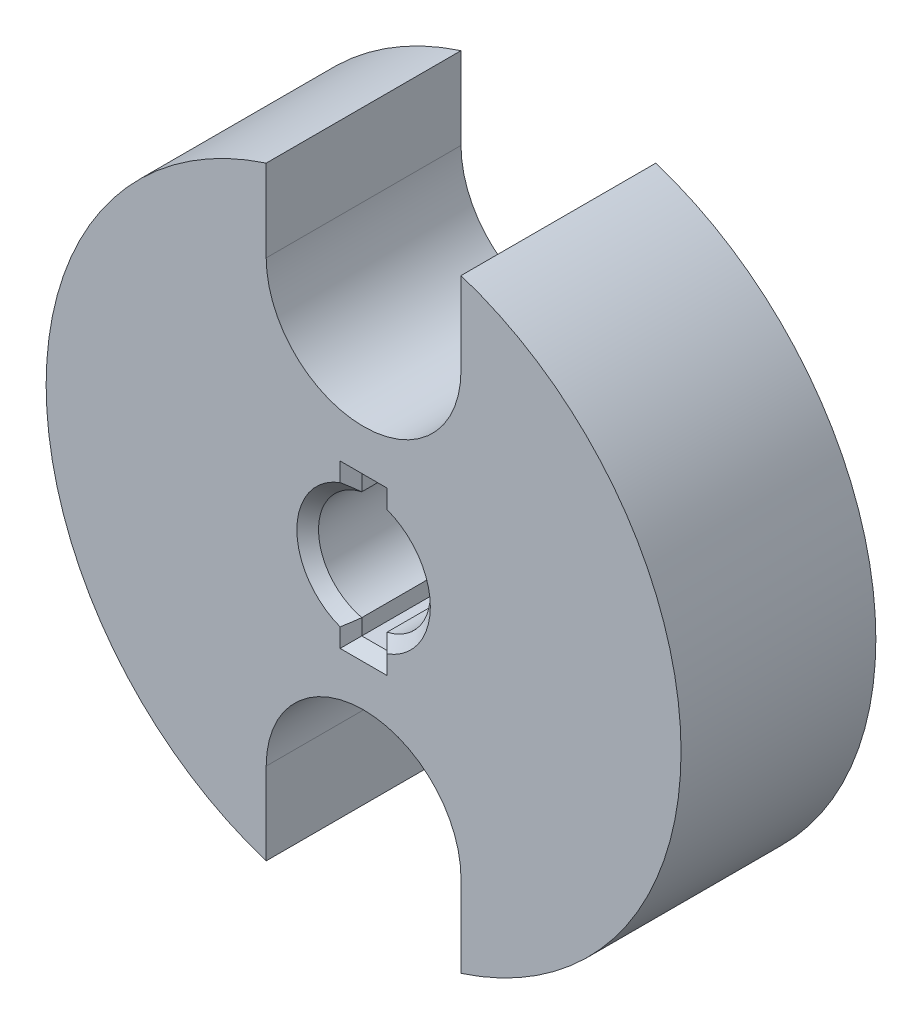
ISO-10303-21;
HEADER;
FILE_DESCRIPTION(('STEP AP214'),'2;1');
FILE_NAME('part.step','',(''),(''),'','','');
FILE_SCHEMA(('AUTOMOTIVE_DESIGN { 1 0 10303 214 1 1 1 1 }'));
ENDSEC;
DATA;
#1=APPLICATION_CONTEXT('core data for automotive mechanical design processes');
#2=APPLICATION_PROTOCOL_DEFINITION('international standard','automotive_design',2000,#1);
#3=PRODUCT_CONTEXT('',#1,'mechanical');
#4=PRODUCT('Part','Part','',(#3));
#5=PRODUCT_RELATED_PRODUCT_CATEGORY('part','',(#4));
#6=PRODUCT_DEFINITION_FORMATION('','',#4);
#7=PRODUCT_DEFINITION_CONTEXT('part definition',#1,'design');
#8=PRODUCT_DEFINITION('design','',#6,#7);
#9=PRODUCT_DEFINITION_SHAPE('','',#8);
#10=(LENGTH_UNIT() NAMED_UNIT(*) SI_UNIT(.MILLI.,.METRE.));
#11=(NAMED_UNIT(*) PLANE_ANGLE_UNIT() SI_UNIT($,.RADIAN.));
#12=(NAMED_UNIT(*) SI_UNIT($,.STERADIAN.) SOLID_ANGLE_UNIT());
#13=UNCERTAINTY_MEASURE_WITH_UNIT(LENGTH_MEASURE(1.E-05),#10,'distance_accuracy_value','');
#14=(GEOMETRIC_REPRESENTATION_CONTEXT(3) GLOBAL_UNCERTAINTY_ASSIGNED_CONTEXT((#13)) GLOBAL_UNIT_ASSIGNED_CONTEXT((#10,
#11,#12)) REPRESENTATION_CONTEXT('',''));
#15=CARTESIAN_POINT('',(0.,0.,0.));
#16=DIRECTION('',(0.,0.,1.));
#17=DIRECTION('',(1.,0.,0.));
#18=AXIS2_PLACEMENT_3D('',#15,#16,#17);
#19=CARTESIAN_POINT('',(0.,0.,12.825));
#20=DIRECTION('',(0.,0.,-1.));
#21=DIRECTION('',(-1.,0.,0.));
#22=AXIS2_PLACEMENT_3D('',#19,#20,#21);
#23=CYLINDRICAL_SURFACE('',#22,3.4875);
#24=DIRECTION('',(0.,0.,-1.));
#25=VECTOR('',#24,1.);
#26=CARTESIAN_POINT('',(-0.787500000000001,3.39742549587184,12.825));
#27=LINE('',#26,#25);
#28=CARTESIAN_POINT('',(-0.787500000000001,3.39742549587184,12.15));
#29=VERTEX_POINT('',#28);
#30=CARTESIAN_POINT('',(-0.787500000000001,3.39742549587184,1.35000000000001));
#31=VERTEX_POINT('',#30);
#32=EDGE_CURVE('E302',#29,#31,#27,.T.);
#33=ORIENTED_EDGE('',*,*,#32,.F.);
#34=CARTESIAN_POINT('',(0.,0.,12.15));
#35=DIRECTION('',(0.,0.,1.));
#36=DIRECTION('',(1.,0.,0.));
#37=AXIS2_PLACEMENT_3D('',#34,#35,#36);
#38=CIRCLE('',#37,3.4875);
#39=CARTESIAN_POINT('',(-0.7875,-3.39742549587184,12.15));
#40=VERTEX_POINT('',#39);
#41=EDGE_CURVE('E11',#29,#40,#38,.T.);
#42=ORIENTED_EDGE('',*,*,#41,.T.);
#43=DIRECTION('',(0.,0.,-1.));
#44=VECTOR('',#43,1.);
#45=CARTESIAN_POINT('',(-0.7875,-3.39742549587184,12.825));
#46=LINE('',#45,#44);
#47=CARTESIAN_POINT('',(-0.7875,-3.39742549587184,1.35000000000001));
#48=VERTEX_POINT('',#47);
#49=EDGE_CURVE('E224',#40,#48,#46,.T.);
#50=ORIENTED_EDGE('',*,*,#49,.T.);
#51=CARTESIAN_POINT('',(0.,0.,1.35000000000001));
#52=DIRECTION('',(0.,0.,1.));
#53=DIRECTION('',(1.,0.,0.));
#54=AXIS2_PLACEMENT_3D('',#51,#52,#53);
#55=CIRCLE('',#54,3.4875);
#56=EDGE_CURVE('E363',#48,#31,#55,.F.);
#57=ORIENTED_EDGE('',*,*,#56,.T.);
#58=EDGE_LOOP('',(#33,#42,#50,#57));
#59=FACE_BOUND('',#58,.T.);
#60=ADVANCED_FACE('F49',(#59),#23,.F.);
#61=CARTESIAN_POINT('',(-0.7875,0.,12.825));
#62=DIRECTION('',(1.,0.,0.));
#63=DIRECTION('',(0.,1.,0.));
#64=AXIS2_PLACEMENT_3D('',#61,#62,#63);
#65=PLANE('',#64);
#66=DIRECTION('',(0.,0.,-1.));
#67=VECTOR('',#66,1.);
#68=CARTESIAN_POINT('',(-0.787500000000001,4.3875,12.825));
#69=LINE('',#68,#67);
#70=CARTESIAN_POINT('',(-0.787500000000001,4.3875,12.15));
#71=VERTEX_POINT('',#70);
#72=CARTESIAN_POINT('',(-0.787500000000001,4.3875,1.35000000000001));
#73=VERTEX_POINT('',#72);
#74=EDGE_CURVE('E299',#71,#73,#69,.T.);
#75=ORIENTED_EDGE('',*,*,#74,.F.);
#76=DIRECTION('',(0.,-1.,0.));
#77=VECTOR('',#76,1.);
#78=CARTESIAN_POINT('',(-0.7875,0.,12.15));
#79=LINE('',#78,#77);
#80=EDGE_CURVE('E59',#71,#29,#79,.T.);
#81=ORIENTED_EDGE('',*,*,#80,.T.);
#82=ORIENTED_EDGE('',*,*,#32,.T.);
#83=DIRECTION('',(0.,1.,0.));
#84=VECTOR('',#83,1.);
#85=CARTESIAN_POINT('',(-0.787500000000001,4.3875,1.35000000000001));
#86=LINE('',#85,#84);
#87=EDGE_CURVE('E367',#31,#73,#86,.T.);
#88=ORIENTED_EDGE('',*,*,#87,.T.);
#89=EDGE_LOOP('',(#75,#81,#82,#88));
#90=FACE_BOUND('',#89,.T.);
#91=ADVANCED_FACE('F624',(#90),#65,.T.);
#92=CARTESIAN_POINT('',(0.,4.3875,12.825));
#93=DIRECTION('',(0.,1.,0.));
#94=DIRECTION('',(0.,0.,1.));
#95=AXIS2_PLACEMENT_3D('',#92,#93,#94);
#96=PLANE('',#95);
#97=DIRECTION('',(0.,0.,-1.));
#98=VECTOR('',#97,1.);
#99=CARTESIAN_POINT('',(0.787499999999999,4.3875,12.825));
#100=LINE('',#99,#98);
#101=CARTESIAN_POINT('',(0.787499999999999,4.3875,12.15));
#102=VERTEX_POINT('',#101);
#103=CARTESIAN_POINT('',(0.787499999999999,4.3875,1.35000000000001));
#104=VERTEX_POINT('',#103);
#105=EDGE_CURVE('E296',#102,#104,#100,.T.);
#106=ORIENTED_EDGE('',*,*,#105,.F.);
#107=DIRECTION('',(-1.,0.,0.));
#108=VECTOR('',#107,1.);
#109=CARTESIAN_POINT('',(-0.787500000000001,4.3875,12.15));
#110=LINE('',#109,#108);
#111=EDGE_CURVE('E74',#102,#71,#110,.T.);
#112=ORIENTED_EDGE('',*,*,#111,.T.);
#113=ORIENTED_EDGE('',*,*,#74,.T.);
#114=DIRECTION('',(1.,0.,0.));
#115=VECTOR('',#114,1.);
#116=CARTESIAN_POINT('',(0.,4.3875,1.35000000000001));
#117=LINE('',#116,#115);
#118=EDGE_CURVE('E371',#73,#104,#117,.T.);
#119=ORIENTED_EDGE('',*,*,#118,.T.);
#120=EDGE_LOOP('',(#106,#112,#113,#119));
#121=FACE_BOUND('',#120,.T.);
#122=ADVANCED_FACE('F625',(#121),#96,.F.);
#123=CARTESIAN_POINT('',(0.7875,0.,12.825));
#124=DIRECTION('',(1.,0.,0.));
#125=DIRECTION('',(0.,1.,0.));
#126=AXIS2_PLACEMENT_3D('',#123,#124,#125);
#127=PLANE('',#126);
#128=DIRECTION('',(0.,0.,-1.));
#129=VECTOR('',#128,1.);
#130=CARTESIAN_POINT('',(0.787499999999999,3.39742549587184,12.825));
#131=LINE('',#130,#129);
#132=CARTESIAN_POINT('',(0.787499999999999,3.39742549587184,12.15));
#133=VERTEX_POINT('',#132);
#134=CARTESIAN_POINT('',(0.787499999999999,3.39742549587184,1.35000000000001));
#135=VERTEX_POINT('',#134);
#136=EDGE_CURVE('E293',#133,#135,#131,.T.);
#137=ORIENTED_EDGE('',*,*,#136,.F.);
#138=DIRECTION('',(0.,1.,0.));
#139=VECTOR('',#138,1.);
#140=CARTESIAN_POINT('',(0.787499999999999,4.3875,12.15));
#141=LINE('',#140,#139);
#142=EDGE_CURVE('E499',#133,#102,#141,.T.);
#143=ORIENTED_EDGE('',*,*,#142,.T.);
#144=ORIENTED_EDGE('',*,*,#105,.T.);
#145=DIRECTION('',(0.,-1.,0.));
#146=VECTOR('',#145,1.);
#147=CARTESIAN_POINT('',(0.7875,0.,1.35000000000001));
#148=LINE('',#147,#146);
#149=EDGE_CURVE('E375',#104,#135,#148,.T.);
#150=ORIENTED_EDGE('',*,*,#149,.T.);
#151=EDGE_LOOP('',(#137,#143,#144,#150));
#152=FACE_BOUND('',#151,.T.);
#153=ADVANCED_FACE('F636',(#152),#127,.F.);
#154=DIRECTION('',(0.,0.,-1.));
#155=VECTOR('',#154,1.);
#156=CARTESIAN_POINT('',(0.7875,-3.39742549587184,12.825));
#157=LINE('',#156,#155);
#158=CARTESIAN_POINT('',(0.7875,-3.39742549587184,12.15));
#159=VERTEX_POINT('',#158);
#160=CARTESIAN_POINT('',(0.7875,-3.39742549587184,1.35000000000001));
#161=VERTEX_POINT('',#160);
#162=EDGE_CURVE('E290',#159,#161,#157,.T.);
#163=ORIENTED_EDGE('',*,*,#162,.F.);
#164=CARTESIAN_POINT('',(0.,0.,12.15));
#165=DIRECTION('',(0.,0.,1.));
#166=DIRECTION('',(1.,0.,0.));
#167=AXIS2_PLACEMENT_3D('',#164,#165,#166);
#168=CIRCLE('',#167,3.4875);
#169=EDGE_CURVE('E496',#159,#133,#168,.T.);
#170=ORIENTED_EDGE('',*,*,#169,.T.);
#171=ORIENTED_EDGE('',*,*,#136,.T.);
#172=CARTESIAN_POINT('',(0.,0.,1.35000000000001));
#173=DIRECTION('',(0.,0.,1.));
#174=DIRECTION('',(1.,0.,0.));
#175=AXIS2_PLACEMENT_3D('',#172,#173,#174);
#176=CIRCLE('',#175,3.4875);
#177=EDGE_CURVE('E379',#135,#161,#176,.F.);
#178=ORIENTED_EDGE('',*,*,#177,.T.);
#179=EDGE_LOOP('',(#163,#170,#171,#178));
#180=FACE_BOUND('',#179,.T.);
#181=ADVANCED_FACE('F639',(#180),#23,.F.);
#182=DIRECTION('',(0.,0.,-1.));
#183=VECTOR('',#182,1.);
#184=CARTESIAN_POINT('',(0.7875,-4.3875,12.825));
#185=LINE('',#184,#183);
#186=CARTESIAN_POINT('',(0.7875,-4.3875,12.15));
#187=VERTEX_POINT('',#186);
#188=CARTESIAN_POINT('',(0.7875,-4.3875,1.35000000000001));
#189=VERTEX_POINT('',#188);
#190=EDGE_CURVE('E287',#187,#189,#185,.T.);
#191=ORIENTED_EDGE('',*,*,#190,.F.);
#192=DIRECTION('',(0.,1.,0.));
#193=VECTOR('',#192,1.);
#194=CARTESIAN_POINT('',(0.7875,-3.39742549587184,12.15));
#195=LINE('',#194,#193);
#196=EDGE_CURVE('E493',#187,#159,#195,.T.);
#197=ORIENTED_EDGE('',*,*,#196,.T.);
#198=ORIENTED_EDGE('',*,*,#162,.T.);
#199=DIRECTION('',(0.,-1.,0.));
#200=VECTOR('',#199,1.);
#201=CARTESIAN_POINT('',(0.7875,0.,1.35000000000001));
#202=LINE('',#201,#200);
#203=EDGE_CURVE('E305',#161,#189,#202,.T.);
#204=ORIENTED_EDGE('',*,*,#203,.T.);
#205=EDGE_LOOP('',(#191,#197,#198,#204));
#206=FACE_BOUND('',#205,.T.);
#207=ADVANCED_FACE('F643',(#206),#127,.F.);
#208=CARTESIAN_POINT('',(0.,-4.3875,12.825));
#209=DIRECTION('',(0.,1.,0.));
#210=DIRECTION('',(0.,0.,1.));
#211=AXIS2_PLACEMENT_3D('',#208,#209,#210);
#212=PLANE('',#211);
#213=DIRECTION('',(0.,0.,-1.));
#214=VECTOR('',#213,1.);
#215=CARTESIAN_POINT('',(-0.7875,-4.3875,12.825));
#216=LINE('',#215,#214);
#217=CARTESIAN_POINT('',(-0.7875,-4.3875,12.15));
#218=VERTEX_POINT('',#217);
#219=CARTESIAN_POINT('',(-0.7875,-4.3875,1.35000000000001));
#220=VERTEX_POINT('',#219);
#221=EDGE_CURVE('E284',#218,#220,#216,.T.);
#222=ORIENTED_EDGE('',*,*,#221,.F.);
#223=DIRECTION('',(1.,0.,0.));
#224=VECTOR('',#223,1.);
#225=CARTESIAN_POINT('',(0.,-4.3875,12.15));
#226=LINE('',#225,#224);
#227=EDGE_CURVE('E490',#218,#187,#226,.T.);
#228=ORIENTED_EDGE('',*,*,#227,.T.);
#229=ORIENTED_EDGE('',*,*,#190,.T.);
#230=DIRECTION('',(-1.,0.,0.));
#231=VECTOR('',#230,1.);
#232=CARTESIAN_POINT('',(-0.7875,-4.3875,1.35000000000001));
#233=LINE('',#232,#231);
#234=EDGE_CURVE('E355',#189,#220,#233,.T.);
#235=ORIENTED_EDGE('',*,*,#234,.T.);
#236=EDGE_LOOP('',(#222,#228,#229,#235));
#237=FACE_BOUND('',#236,.T.);
#238=ADVANCED_FACE('F646',(#237),#212,.T.);
#239=CARTESIAN_POINT('',(-6.075,0.,12.825));
#240=DIRECTION('',(1.,0.,0.));
#241=DIRECTION('',(0.,1.,0.));
#242=AXIS2_PLACEMENT_3D('',#239,#240,#241);
#243=PLANE('',#242);
#244=DIRECTION('',(0.,-1.,0.));
#245=VECTOR('',#244,1.);
#246=CARTESIAN_POINT('',(-6.075,0.,0.675000000000001));
#247=LINE('',#246,#245);
#248=CARTESIAN_POINT('',(-6.075,18.8450092862805,0.675000000000001));
#249=VERTEX_POINT('',#248);
#250=CARTESIAN_POINT('',(-6.075,13.725,0.675000000000001));
#251=VERTEX_POINT('',#250);
#252=EDGE_CURVE('E219',#249,#251,#247,.T.);
#253=ORIENTED_EDGE('',*,*,#252,.F.);
#254=DIRECTION('',(0.,0.,-1.));
#255=VECTOR('',#254,1.);
#256=CARTESIAN_POINT('',(-6.075,18.8450092862805,12.825));
#257=LINE('',#256,#255);
#258=CARTESIAN_POINT('',(-6.075,18.8450092862805,12.825));
#259=VERTEX_POINT('',#258);
#260=EDGE_CURVE('E212',#259,#249,#257,.T.);
#261=ORIENTED_EDGE('',*,*,#260,.F.);
#262=DIRECTION('',(0.,-1.,0.));
#263=VECTOR('',#262,1.);
#264=CARTESIAN_POINT('',(-6.075,0.,12.825));
#265=LINE('',#264,#263);
#266=CARTESIAN_POINT('',(-6.075,13.725,12.825));
#267=VERTEX_POINT('',#266);
#268=EDGE_CURVE('E216',#259,#267,#265,.T.);
#269=ORIENTED_EDGE('',*,*,#268,.T.);
#270=DIRECTION('',(0.,0.,-1.));
#271=VECTOR('',#270,1.);
#272=CARTESIAN_POINT('',(-6.075,13.725,12.825));
#273=LINE('',#272,#271);
#274=EDGE_CURVE('E264',#267,#251,#273,.T.);
#275=ORIENTED_EDGE('',*,*,#274,.T.);
#276=EDGE_LOOP('',(#253,#261,#269,#275));
#277=FACE_BOUND('',#276,.T.);
#278=ADVANCED_FACE('F214',(#277),#243,.T.);
#279=CARTESIAN_POINT('',(0.,0.,12.825));
#280=DIRECTION('',(0.,0.,-1.));
#281=DIRECTION('',(-1.,0.,0.));
#282=AXIS2_PLACEMENT_3D('',#279,#280,#281);
#283=CYLINDRICAL_SURFACE('',#282,19.8);
#284=CARTESIAN_POINT('',(0.,0.,0.675000000000001));
#285=DIRECTION('',(0.,0.,1.));
#286=DIRECTION('',(1.,0.,0.));
#287=AXIS2_PLACEMENT_3D('',#284,#285,#286);
#288=CIRCLE('',#287,19.8);
#289=CARTESIAN_POINT('',(-6.075,-18.8450092862805,0.675000000000001));
#290=VERTEX_POINT('',#289);
#291=EDGE_CURVE('E267',#249,#290,#288,.T.);
#292=ORIENTED_EDGE('',*,*,#291,.T.);
#293=DIRECTION('',(0.,0.,-1.));
#294=VECTOR('',#293,1.);
#295=CARTESIAN_POINT('',(-6.075,-18.8450092862805,12.825));
#296=LINE('',#295,#294);
#297=CARTESIAN_POINT('',(-6.075,-18.8450092862805,12.825));
#298=VERTEX_POINT('',#297);
#299=EDGE_CURVE('E225',#298,#290,#296,.T.);
#300=ORIENTED_EDGE('',*,*,#299,.F.);
#301=CARTESIAN_POINT('',(0.,0.,12.825));
#302=DIRECTION('',(0.,0.,1.));
#303=DIRECTION('',(1.,0.,0.));
#304=AXIS2_PLACEMENT_3D('',#301,#302,#303);
#305=CIRCLE('',#304,19.8);
#306=EDGE_CURVE('E228',#259,#298,#305,.T.);
#307=ORIENTED_EDGE('',*,*,#306,.F.);
#308=ORIENTED_EDGE('',*,*,#260,.T.);
#309=EDGE_LOOP('',(#292,#300,#307,#308));
#310=FACE_BOUND('',#309,.T.);
#311=ADVANCED_FACE('F229',(#310),#283,.T.);
#312=CARTESIAN_POINT('',(-6.075,-13.725,0.675000000000001));
#313=VERTEX_POINT('',#312);
#314=EDGE_CURVE('E269',#313,#290,#247,.T.);
#315=ORIENTED_EDGE('',*,*,#314,.F.);
#316=DIRECTION('',(0.,0.,-1.));
#317=VECTOR('',#316,1.);
#318=CARTESIAN_POINT('',(-6.075,-13.725,12.825));
#319=LINE('',#318,#317);
#320=CARTESIAN_POINT('',(-6.075,-13.725,12.825));
#321=VERTEX_POINT('',#320);
#322=EDGE_CURVE('E322',#321,#313,#319,.T.);
#323=ORIENTED_EDGE('',*,*,#322,.F.);
#324=EDGE_CURVE('E234',#321,#298,#265,.T.);
#325=ORIENTED_EDGE('',*,*,#324,.T.);
#326=ORIENTED_EDGE('',*,*,#299,.T.);
#327=EDGE_LOOP('',(#315,#323,#325,#326));
#328=FACE_BOUND('',#327,.T.);
#329=ADVANCED_FACE('F854',(#328),#243,.T.);
#330=CARTESIAN_POINT('',(0.,-13.725,12.825));
#331=DIRECTION('',(0.,0.,-1.));
#332=DIRECTION('',(-1.,0.,0.));
#333=AXIS2_PLACEMENT_3D('',#330,#331,#332);
#334=CYLINDRICAL_SURFACE('',#333,6.075);
#335=CARTESIAN_POINT('',(0.,-13.725,0.675000000000001));
#336=DIRECTION('',(0.,0.,1.));
#337=DIRECTION('',(1.,0.,0.));
#338=AXIS2_PLACEMENT_3D('',#335,#336,#337);
#339=CIRCLE('',#338,6.075);
#340=CARTESIAN_POINT('',(6.075,-13.725,0.675000000000001));
#341=VERTEX_POINT('',#340);
#342=EDGE_CURVE('E272',#341,#313,#339,.T.);
#343=ORIENTED_EDGE('',*,*,#342,.F.);
#344=DIRECTION('',(0.,0.,-1.));
#345=VECTOR('',#344,1.);
#346=CARTESIAN_POINT('',(6.075,-13.725,12.825));
#347=LINE('',#346,#345);
#348=CARTESIAN_POINT('',(6.075,-13.725,12.825));
#349=VERTEX_POINT('',#348);
#350=EDGE_CURVE('E319',#349,#341,#347,.T.);
#351=ORIENTED_EDGE('',*,*,#350,.F.);
#352=CARTESIAN_POINT('',(0.,-13.725,12.825));
#353=DIRECTION('',(0.,0.,1.));
#354=DIRECTION('',(1.,0.,0.));
#355=AXIS2_PLACEMENT_3D('',#352,#353,#354);
#356=CIRCLE('',#355,6.075);
#357=EDGE_CURVE('E247',#349,#321,#356,.T.);
#358=ORIENTED_EDGE('',*,*,#357,.T.);
#359=ORIENTED_EDGE('',*,*,#322,.T.);
#360=EDGE_LOOP('',(#343,#351,#358,#359));
#361=FACE_BOUND('',#360,.T.);
#362=ADVANCED_FACE('F846',(#361),#334,.F.);
#363=CARTESIAN_POINT('',(6.075,0.,12.825));
#364=DIRECTION('',(1.,0.,0.));
#365=DIRECTION('',(0.,1.,0.));
#366=AXIS2_PLACEMENT_3D('',#363,#364,#365);
#367=PLANE('',#366);
#368=DIRECTION('',(0.,-1.,0.));
#369=VECTOR('',#368,1.);
#370=CARTESIAN_POINT('',(6.075,0.,0.675000000000001));
#371=LINE('',#370,#369);
#372=CARTESIAN_POINT('',(6.075,-18.8450092862805,0.675000000000001));
#373=VERTEX_POINT('',#372);
#374=EDGE_CURVE('E276',#341,#373,#371,.T.);
#375=ORIENTED_EDGE('',*,*,#374,.T.);
#376=DIRECTION('',(0.,0.,-1.));
#377=VECTOR('',#376,1.);
#378=CARTESIAN_POINT('',(6.075,-18.8450092862805,12.825));
#379=LINE('',#378,#377);
#380=CARTESIAN_POINT('',(6.075,-18.8450092862805,12.825));
#381=VERTEX_POINT('',#380);
#382=EDGE_CURVE('E315',#381,#373,#379,.T.);
#383=ORIENTED_EDGE('',*,*,#382,.F.);
#384=DIRECTION('',(0.,-1.,0.));
#385=VECTOR('',#384,1.);
#386=CARTESIAN_POINT('',(6.075,0.,12.825));
#387=LINE('',#386,#385);
#388=EDGE_CURVE('E251',#349,#381,#387,.T.);
#389=ORIENTED_EDGE('',*,*,#388,.F.);
#390=ORIENTED_EDGE('',*,*,#350,.T.);
#391=EDGE_LOOP('',(#375,#383,#389,#390));
#392=FACE_BOUND('',#391,.T.);
#393=ADVANCED_FACE('F673',(#392),#367,.F.);
#394=CARTESIAN_POINT('',(0.,0.,12.825));
#395=DIRECTION('',(0.,0.,-1.));
#396=DIRECTION('',(-1.,0.,0.));
#397=AXIS2_PLACEMENT_3D('',#394,#395,#396);
#398=CYLINDRICAL_SURFACE('',#397,19.8);
#399=CARTESIAN_POINT('',(0.,0.,0.675000000000001));
#400=DIRECTION('',(0.,0.,1.));
#401=DIRECTION('',(1.,0.,0.));
#402=AXIS2_PLACEMENT_3D('',#399,#400,#401);
#403=CIRCLE('',#402,19.8);
#404=CARTESIAN_POINT('',(6.075,18.8450092862805,0.675000000000001));
#405=VERTEX_POINT('',#404);
#406=EDGE_CURVE('E279',#373,#405,#403,.T.);
#407=ORIENTED_EDGE('',*,*,#406,.T.);
#408=DIRECTION('',(0.,0.,-1.));
#409=VECTOR('',#408,1.);
#410=CARTESIAN_POINT('',(6.075,18.8450092862805,12.825));
#411=LINE('',#410,#409);
#412=CARTESIAN_POINT('',(6.075,18.8450092862805,12.825));
#413=VERTEX_POINT('',#412);
#414=EDGE_CURVE('E311',#413,#405,#411,.T.);
#415=ORIENTED_EDGE('',*,*,#414,.F.);
#416=CARTESIAN_POINT('',(0.,0.,12.825));
#417=DIRECTION('',(0.,0.,1.));
#418=DIRECTION('',(1.,0.,0.));
#419=AXIS2_PLACEMENT_3D('',#416,#417,#418);
#420=CIRCLE('',#419,19.8);
#421=EDGE_CURVE('E256',#381,#413,#420,.T.);
#422=ORIENTED_EDGE('',*,*,#421,.F.);
#423=ORIENTED_EDGE('',*,*,#382,.T.);
#424=EDGE_LOOP('',(#407,#415,#422,#423));
#425=FACE_BOUND('',#424,.T.);
#426=ADVANCED_FACE('F671',(#425),#398,.T.);
#427=CARTESIAN_POINT('',(6.075,13.725,0.675000000000001));
#428=VERTEX_POINT('',#427);
#429=EDGE_CURVE('E244',#405,#428,#371,.T.);
#430=ORIENTED_EDGE('',*,*,#429,.T.);
#431=DIRECTION('',(0.,0.,-1.));
#432=VECTOR('',#431,1.);
#433=CARTESIAN_POINT('',(6.075,13.725,12.825));
#434=LINE('',#433,#432);
#435=CARTESIAN_POINT('',(6.075,13.725,12.825));
#436=VERTEX_POINT('',#435);
#437=EDGE_CURVE('E308',#436,#428,#434,.T.);
#438=ORIENTED_EDGE('',*,*,#437,.F.);
#439=EDGE_CURVE('E258',#413,#436,#387,.T.);
#440=ORIENTED_EDGE('',*,*,#439,.F.);
#441=ORIENTED_EDGE('',*,*,#414,.T.);
#442=EDGE_LOOP('',(#430,#438,#440,#441));
#443=FACE_BOUND('',#442,.T.);
#444=ADVANCED_FACE('F657',(#443),#367,.F.);
#445=CARTESIAN_POINT('',(0.,13.725,12.825));
#446=DIRECTION('',(0.,0.,-1.));
#447=DIRECTION('',(-1.,0.,0.));
#448=AXIS2_PLACEMENT_3D('',#445,#446,#447);
#449=CYLINDRICAL_SURFACE('',#448,6.075);
#450=CARTESIAN_POINT('',(0.,13.725,0.675000000000001));
#451=DIRECTION('',(0.,0.,1.));
#452=DIRECTION('',(1.,0.,0.));
#453=AXIS2_PLACEMENT_3D('',#450,#451,#452);
#454=CIRCLE('',#453,6.075);
#455=EDGE_CURVE('E240',#251,#428,#454,.T.);
#456=ORIENTED_EDGE('',*,*,#455,.F.);
#457=ORIENTED_EDGE('',*,*,#274,.F.);
#458=CARTESIAN_POINT('',(0.,13.725,12.825));
#459=DIRECTION('',(0.,0.,1.));
#460=DIRECTION('',(1.,0.,0.));
#461=AXIS2_PLACEMENT_3D('',#458,#459,#460);
#462=CIRCLE('',#461,6.075);
#463=EDGE_CURVE('E238',#267,#436,#462,.T.);
#464=ORIENTED_EDGE('',*,*,#463,.T.);
#465=ORIENTED_EDGE('',*,*,#437,.T.);
#466=EDGE_LOOP('',(#456,#457,#464,#465));
#467=FACE_BOUND('',#466,.T.);
#468=ADVANCED_FACE('F663',(#467),#449,.F.);
#469=ORIENTED_EDGE('',*,*,#49,.F.);
#470=DIRECTION('',(0.,-1.,0.));
#471=VECTOR('',#470,1.);
#472=CARTESIAN_POINT('',(-0.7875,0.,12.15));
#473=LINE('',#472,#471);
#474=EDGE_CURVE('E383',#40,#218,#473,.T.);
#475=ORIENTED_EDGE('',*,*,#474,.T.);
#476=ORIENTED_EDGE('',*,*,#221,.T.);
#477=DIRECTION('',(0.,1.,0.));
#478=VECTOR('',#477,1.);
#479=CARTESIAN_POINT('',(-0.7875,-3.39742549587184,1.35000000000001));
#480=LINE('',#479,#478);
#481=EDGE_CURVE('E359',#220,#48,#480,.T.);
#482=ORIENTED_EDGE('',*,*,#481,.T.);
#483=EDGE_LOOP('',(#469,#475,#476,#482));
#484=FACE_BOUND('',#483,.T.);
#485=ADVANCED_FACE('F604',(#484),#65,.T.);
#486=CARTESIAN_POINT('',(0.,0.,12.825));
#487=DIRECTION('',(0.,0.,1.));
#488=DIRECTION('',(1.,0.,0.));
#489=AXIS2_PLACEMENT_3D('',#486,#487,#488);
#490=PLANE('',#489);
#491=DIRECTION('',(-1.,0.,0.));
#492=VECTOR('',#491,1.);
#493=CARTESIAN_POINT('',(0.,-5.0625,12.825));
#494=LINE('',#493,#492);
#495=CARTESIAN_POINT('',(1.4625,-5.0625,12.825));
#496=VERTEX_POINT('',#495);
#497=CARTESIAN_POINT('',(-1.4625,-5.0625,12.825));
#498=VERTEX_POINT('',#497);
#499=EDGE_CURVE('E483',#496,#498,#494,.T.);
#500=ORIENTED_EDGE('',*,*,#499,.T.);
#501=DIRECTION('',(0.,1.,0.));
#502=VECTOR('',#501,1.);
#503=CARTESIAN_POINT('',(-1.4625,0.,12.825));
#504=LINE('',#503,#502);
#505=CARTESIAN_POINT('',(-1.4625,-3.89711431702997,12.825));
#506=VERTEX_POINT('',#505);
#507=EDGE_CURVE('E486',#498,#506,#504,.T.);
#508=ORIENTED_EDGE('',*,*,#507,.T.);
#509=CARTESIAN_POINT('',(0.,0.,12.825));
#510=DIRECTION('',(0.,0.,1.));
#511=DIRECTION('',(1.,0.,0.));
#512=AXIS2_PLACEMENT_3D('',#509,#510,#511);
#513=CIRCLE('',#512,4.1625);
#514=CARTESIAN_POINT('',(-1.4625,3.89711431702997,12.825));
#515=VERTEX_POINT('',#514);
#516=EDGE_CURVE('E465',#506,#515,#513,.F.);
#517=ORIENTED_EDGE('',*,*,#516,.T.);
#518=DIRECTION('',(0.,1.,0.));
#519=VECTOR('',#518,1.);
#520=CARTESIAN_POINT('',(-1.4625,0.,12.825));
#521=LINE('',#520,#519);
#522=CARTESIAN_POINT('',(-1.4625,5.0625,12.825));
#523=VERTEX_POINT('',#522);
#524=EDGE_CURVE('E468',#515,#523,#521,.T.);
#525=ORIENTED_EDGE('',*,*,#524,.T.);
#526=DIRECTION('',(1.,0.,0.));
#527=VECTOR('',#526,1.);
#528=CARTESIAN_POINT('',(0.787499999999999,5.0625,12.825));
#529=LINE('',#528,#527);
#530=CARTESIAN_POINT('',(1.4625,5.0625,12.825));
#531=VERTEX_POINT('',#530);
#532=EDGE_CURVE('E471',#523,#531,#529,.T.);
#533=ORIENTED_EDGE('',*,*,#532,.T.);
#534=DIRECTION('',(0.,-1.,0.));
#535=VECTOR('',#534,1.);
#536=CARTESIAN_POINT('',(1.4625,3.39742549587184,12.825));
#537=LINE('',#536,#535);
#538=CARTESIAN_POINT('',(1.4625,3.89711431702997,12.825));
#539=VERTEX_POINT('',#538);
#540=EDGE_CURVE('E474',#531,#539,#537,.T.);
#541=ORIENTED_EDGE('',*,*,#540,.T.);
#542=CARTESIAN_POINT('',(0.,0.,12.825));
#543=DIRECTION('',(0.,0.,1.));
#544=DIRECTION('',(1.,0.,0.));
#545=AXIS2_PLACEMENT_3D('',#542,#543,#544);
#546=CIRCLE('',#545,4.1625);
#547=CARTESIAN_POINT('',(1.4625,-3.89711431702997,12.825));
#548=VERTEX_POINT('',#547);
#549=EDGE_CURVE('E477',#539,#548,#546,.F.);
#550=ORIENTED_EDGE('',*,*,#549,.T.);
#551=DIRECTION('',(0.,-1.,0.));
#552=VECTOR('',#551,1.);
#553=CARTESIAN_POINT('',(1.4625,-4.3875,12.825));
#554=LINE('',#553,#552);
#555=EDGE_CURVE('E480',#548,#496,#554,.T.);
#556=ORIENTED_EDGE('',*,*,#555,.T.);
#557=EDGE_LOOP('',(#500,#508,#517,#525,#533,#541,#550,#556));
#558=FACE_BOUND('',#557,.T.);
#559=ORIENTED_EDGE('',*,*,#268,.F.);
#560=ORIENTED_EDGE('',*,*,#306,.T.);
#561=ORIENTED_EDGE('',*,*,#324,.F.);
#562=ORIENTED_EDGE('',*,*,#357,.F.);
#563=ORIENTED_EDGE('',*,*,#388,.T.);
#564=ORIENTED_EDGE('',*,*,#421,.T.);
#565=ORIENTED_EDGE('',*,*,#439,.T.);
#566=ORIENTED_EDGE('',*,*,#463,.F.);
#567=EDGE_LOOP('',(#559,#560,#561,#562,#563,#564,#565,#566));
#568=FACE_BOUND('',#567,.T.);
#569=ADVANCED_FACE('F236',(#558,#568),#490,.T.);
#570=CARTESIAN_POINT('',(0.,0.,0.675000000000001));
#571=DIRECTION('',(0.,0.,1.));
#572=DIRECTION('',(1.,0.,0.));
#573=AXIS2_PLACEMENT_3D('',#570,#571,#572);
#574=PLANE('',#573);
#575=DIRECTION('',(1.,0.,0.));
#576=VECTOR('',#575,1.);
#577=CARTESIAN_POINT('',(0.7875,-5.0625,0.675000000000001));
#578=LINE('',#577,#576);
#579=CARTESIAN_POINT('',(-1.4625,-5.0625,0.675000000000001));
#580=VERTEX_POINT('',#579);
#581=CARTESIAN_POINT('',(1.4625,-5.0625,0.675000000000001));
#582=VERTEX_POINT('',#581);
#583=EDGE_CURVE('E348',#580,#582,#578,.T.);
#584=ORIENTED_EDGE('',*,*,#583,.T.);
#585=DIRECTION('',(0.,1.,0.));
#586=VECTOR('',#585,1.);
#587=CARTESIAN_POINT('',(1.4625,0.,0.675000000000001));
#588=LINE('',#587,#586);
#589=CARTESIAN_POINT('',(1.4625,-3.89711431702998,0.675000000000001));
#590=VERTEX_POINT('',#589);
#591=EDGE_CURVE('E351',#582,#590,#588,.T.);
#592=ORIENTED_EDGE('',*,*,#591,.T.);
#593=CARTESIAN_POINT('',(0.,0.,0.675000000000001));
#594=DIRECTION('',(0.,0.,1.));
#595=DIRECTION('',(1.,0.,0.));
#596=AXIS2_PLACEMENT_3D('',#593,#594,#595);
#597=CIRCLE('',#596,4.1625);
#598=CARTESIAN_POINT('',(1.4625,3.89711431702998,0.675000000000001));
#599=VERTEX_POINT('',#598);
#600=EDGE_CURVE('E330',#590,#599,#597,.T.);
#601=ORIENTED_EDGE('',*,*,#600,.T.);
#602=DIRECTION('',(0.,1.,0.));
#603=VECTOR('',#602,1.);
#604=CARTESIAN_POINT('',(1.4625,0.,0.675000000000001));
#605=LINE('',#604,#603);
#606=CARTESIAN_POINT('',(1.4625,5.0625,0.675000000000001));
#607=VERTEX_POINT('',#606);
#608=EDGE_CURVE('E333',#599,#607,#605,.T.);
#609=ORIENTED_EDGE('',*,*,#608,.T.);
#610=DIRECTION('',(-1.,0.,0.));
#611=VECTOR('',#610,1.);
#612=CARTESIAN_POINT('',(0.,5.0625,0.675000000000001));
#613=LINE('',#612,#611);
#614=CARTESIAN_POINT('',(-1.4625,5.0625,0.675000000000001));
#615=VERTEX_POINT('',#614);
#616=EDGE_CURVE('E336',#607,#615,#613,.T.);
#617=ORIENTED_EDGE('',*,*,#616,.T.);
#618=DIRECTION('',(0.,-1.,0.));
#619=VECTOR('',#618,1.);
#620=CARTESIAN_POINT('',(-1.4625,3.39742549587184,0.675000000000001));
#621=LINE('',#620,#619);
#622=CARTESIAN_POINT('',(-1.4625,3.89711431702998,0.675000000000001));
#623=VERTEX_POINT('',#622);
#624=EDGE_CURVE('E339',#615,#623,#621,.T.);
#625=ORIENTED_EDGE('',*,*,#624,.T.);
#626=CARTESIAN_POINT('',(0.,0.,0.675000000000001));
#627=DIRECTION('',(0.,0.,1.));
#628=DIRECTION('',(1.,0.,0.));
#629=AXIS2_PLACEMENT_3D('',#626,#627,#628);
#630=CIRCLE('',#629,4.1625);
#631=CARTESIAN_POINT('',(-1.4625,-3.89711431702998,0.675000000000001));
#632=VERTEX_POINT('',#631);
#633=EDGE_CURVE('E342',#623,#632,#630,.T.);
#634=ORIENTED_EDGE('',*,*,#633,.T.);
#635=DIRECTION('',(0.,-1.,0.));
#636=VECTOR('',#635,1.);
#637=CARTESIAN_POINT('',(-1.4625,-4.3875,0.675000000000001));
#638=LINE('',#637,#636);
#639=EDGE_CURVE('E345',#632,#580,#638,.T.);
#640=ORIENTED_EDGE('',*,*,#639,.T.);
#641=EDGE_LOOP('',(#584,#592,#601,#609,#617,#625,#634,#640));
#642=FACE_BOUND('',#641,.T.);
#643=ORIENTED_EDGE('',*,*,#252,.T.);
#644=ORIENTED_EDGE('',*,*,#455,.T.);
#645=ORIENTED_EDGE('',*,*,#429,.F.);
#646=ORIENTED_EDGE('',*,*,#406,.F.);
#647=ORIENTED_EDGE('',*,*,#374,.F.);
#648=ORIENTED_EDGE('',*,*,#342,.T.);
#649=ORIENTED_EDGE('',*,*,#314,.T.);
#650=ORIENTED_EDGE('',*,*,#291,.F.);
#651=EDGE_LOOP('',(#643,#644,#645,#646,#647,#648,#649,#650));
#652=FACE_BOUND('',#651,.T.);
#653=ADVANCED_FACE('F448',(#642,#652),#574,.F.);
#654=CARTESIAN_POINT('',(-1.4625,0.,0.675000000000001));
#655=DIRECTION('',(0.707106781186551,0.,-0.707106781186544));
#656=DIRECTION('',(0.,1.,0.));
#657=AXIS2_PLACEMENT_3D('',#654,#655,#656);
#658=PLANE('',#657);
#659=CARTESIAN_POINT('',(-0.787500000000001,3.39742549587184,1.35000000000001));
#660=CARTESIAN_POINT('',(-0.842865288451978,3.4414224073892,1.29463471154803));
#661=CARTESIAN_POINT('',(-0.898485737378516,3.48477336305969,1.23901426262149));
#662=CARTESIAN_POINT('',(-1.01017621892974,3.57026378473956,1.12732378107027));
#663=CARTESIAN_POINT('',(-1.06624616037706,3.61240348887182,1.07125383962295));
#664=CARTESIAN_POINT('',(-1.17879443327992,3.69556739308674,0.958705566720085));
#665=CARTESIAN_POINT('',(-1.23527274710235,3.73659164097385,0.902227252897655));
#666=CARTESIAN_POINT('',(-1.34861197164369,3.81760950749252,0.788888028356311));
#667=CARTESIAN_POINT('',(-1.4054729558655,3.85760292055904,0.732027044134503));
#668=CARTESIAN_POINT('',(-1.4625,3.89711431702998,0.675000000000001));
#669=B_SPLINE_CURVE_WITH_KNOTS('',3,(#659,#660,#661,#662,#663,#664,#665,#666,#667,#668),
.UNSPECIFIED.,.F.,.F.,(4,2,2,2,4),(0.,0.269433014777864,0.538812693672041,0.808180809665343,
1.07760223279315),.UNSPECIFIED.);
#670=EDGE_CURVE('E451',#623,#31,#669,.F.);
#671=ORIENTED_EDGE('',*,*,#670,.F.);
#672=ORIENTED_EDGE('',*,*,#624,.F.);
#673=DIRECTION('',(0.577350269189624,-0.577350269189624,0.577350269189629));
#674=VECTOR('',#673,1.);
#675=CARTESIAN_POINT('',(0.224999999999987,3.37500000000001,2.36250000000001));
#676=LINE('',#675,#674);
#677=EDGE_CURVE('E268',#73,#615,#676,.F.);
#678=ORIENTED_EDGE('',*,*,#677,.F.);
#679=ORIENTED_EDGE('',*,*,#87,.F.);
#680=EDGE_LOOP('',(#671,#672,#678,#679));
#681=FACE_BOUND('',#680,.T.);
#682=ADVANCED_FACE('F443',(#681),#658,.T.);
#683=CARTESIAN_POINT('',(0.,4.3875,1.35000000000001));
#684=DIRECTION('',(0.,0.707106781186551,0.707106781186544));
#685=DIRECTION('',(1.,0.,0.));
#686=AXIS2_PLACEMENT_3D('',#683,#684,#685);
#687=PLANE('',#686);
#688=ORIENTED_EDGE('',*,*,#677,.T.);
#689=ORIENTED_EDGE('',*,*,#616,.F.);
#690=DIRECTION('',(0.577350269189624,0.577350269189624,-0.577350269189629));
#691=VECTOR('',#690,1.);
#692=CARTESIAN_POINT('',(0.525000000000001,4.125,1.61250000000001));
#693=LINE('',#692,#691);
#694=EDGE_CURVE('E437',#104,#607,#693,.T.);
#695=ORIENTED_EDGE('',*,*,#694,.F.);
#696=ORIENTED_EDGE('',*,*,#118,.F.);
#697=EDGE_LOOP('',(#688,#689,#695,#696));
#698=FACE_BOUND('',#697,.T.);
#699=ADVANCED_FACE('F447',(#698),#687,.F.);
#700=CARTESIAN_POINT('',(0.,0.,0.675000000000001));
#701=DIRECTION('',(0.,0.,-1.));
#702=DIRECTION('',(-1.,0.,0.));
#703=AXIS2_PLACEMENT_3D('',#700,#701,#702);
#704=CONICAL_SURFACE('',#703,4.1625,0.785398163397444);
#705=ORIENTED_EDGE('',*,*,#670,.T.);
#706=ORIENTED_EDGE('',*,*,#56,.F.);
#707=CARTESIAN_POINT('',(-0.7875,-3.39742549587184,1.35000000000001));
#708=CARTESIAN_POINT('',(-0.842865288451977,-3.4414224073892,1.29463471154803));
#709=CARTESIAN_POINT('',(-0.898485737378514,-3.48477336305969,1.23901426262149));
#710=CARTESIAN_POINT('',(-1.01017621892974,-3.57026378473956,1.12732378107027));
#711=CARTESIAN_POINT('',(-1.06624616037706,-3.61240348887182,1.07125383962295));
#712=CARTESIAN_POINT('',(-1.17879443327992,-3.69556739308674,0.958705566720085));
#713=CARTESIAN_POINT('',(-1.23527274710235,-3.73659164097385,0.902227252897655));
#714=CARTESIAN_POINT('',(-1.34861197164369,-3.81760950749252,0.788888028356311));
#715=CARTESIAN_POINT('',(-1.4054729558655,-3.85760292055904,0.732027044134503));
#716=CARTESIAN_POINT('',(-1.4625,-3.89711431702998,0.675000000000001));
#717=B_SPLINE_CURVE_WITH_KNOTS('',3,(#707,#708,#709,#710,#711,#712,#713,#714,#715,#716),
.UNSPECIFIED.,.F.,.F.,(4,2,2,2,4),(0.,0.269433014777864,0.538812693672041,0.808180809665343,
1.07760223279316),.UNSPECIFIED.);
#718=EDGE_CURVE('E429',#632,#48,#717,.F.);
#719=ORIENTED_EDGE('',*,*,#718,.F.);
#720=ORIENTED_EDGE('',*,*,#633,.F.);
#721=EDGE_LOOP('',(#705,#706,#719,#720));
#722=FACE_BOUND('',#721,.T.);
#723=ADVANCED_FACE('F417',(#722),#704,.F.);
#724=CARTESIAN_POINT('',(0.7875,0.,1.35000000000001));
#725=DIRECTION('',(0.707106781186551,0.,0.707106781186544));
#726=DIRECTION('',(0.,-1.,0.));
#727=AXIS2_PLACEMENT_3D('',#724,#725,#726);
#728=PLANE('',#727);
#729=ORIENTED_EDGE('',*,*,#694,.T.);
#730=ORIENTED_EDGE('',*,*,#608,.F.);
#731=CARTESIAN_POINT('',(0.787499999999999,3.39742549587184,1.35000000000001));
#732=CARTESIAN_POINT('',(0.842865288451976,3.4414224073892,1.29463471154803));
#733=CARTESIAN_POINT('',(0.898485737378514,3.48477336305969,1.23901426262149));
#734=CARTESIAN_POINT('',(1.01017621892974,3.57026378473956,1.12732378107027));
#735=CARTESIAN_POINT('',(1.06624616037706,3.61240348887182,1.07125383962295));
#736=CARTESIAN_POINT('',(1.17879443327992,3.69556739308674,0.958705566720085));
#737=CARTESIAN_POINT('',(1.23527274710235,3.73659164097385,0.902227252897655));
#738=CARTESIAN_POINT('',(1.34861197164369,3.81760950749252,0.788888028356311));
#739=CARTESIAN_POINT('',(1.4054729558655,3.85760292055904,0.732027044134503));
#740=CARTESIAN_POINT('',(1.4625,3.89711431702998,0.675000000000001));
#741=B_SPLINE_CURVE_WITH_KNOTS('',3,(#731,#732,#733,#734,#735,#736,#737,#738,#739,#740),
.UNSPECIFIED.,.F.,.F.,(4,2,2,2,4),(0.,0.269433014777865,0.538812693672041,0.808180809665343,
1.07760223279316),.UNSPECIFIED.);
#742=EDGE_CURVE('E421',#135,#599,#741,.T.);
#743=ORIENTED_EDGE('',*,*,#742,.F.);
#744=ORIENTED_EDGE('',*,*,#149,.F.);
#745=EDGE_LOOP('',(#729,#730,#743,#744));
#746=FACE_BOUND('',#745,.T.);
#747=ADVANCED_FACE('F412',(#746),#728,.F.);
#748=CARTESIAN_POINT('',(-1.4625,0.,0.675000000000001));
#749=DIRECTION('',(0.707106781186551,0.,-0.707106781186544));
#750=DIRECTION('',(0.,1.,0.));
#751=AXIS2_PLACEMENT_3D('',#748,#749,#750);
#752=PLANE('',#751);
#753=ORIENTED_EDGE('',*,*,#718,.T.);
#754=ORIENTED_EDGE('',*,*,#481,.F.);
#755=DIRECTION('',(-0.577350269189624,-0.577350269189624,-0.577350269189629));
#756=VECTOR('',#755,1.);
#757=CARTESIAN_POINT('',(-0.975000000000005,-4.57500000000001,1.1625));
#758=LINE('',#757,#756);
#759=EDGE_CURVE('E397',#580,#220,#758,.F.);
#760=ORIENTED_EDGE('',*,*,#759,.F.);
#761=ORIENTED_EDGE('',*,*,#639,.F.);
#762=EDGE_LOOP('',(#753,#754,#760,#761));
#763=FACE_BOUND('',#762,.T.);
#764=ADVANCED_FACE('F416',(#763),#752,.T.);
#765=CARTESIAN_POINT('',(0.,0.,0.675000000000001));
#766=DIRECTION('',(0.,0.,-1.));
#767=DIRECTION('',(-1.,0.,0.));
#768=AXIS2_PLACEMENT_3D('',#765,#766,#767);
#769=CONICAL_SURFACE('',#768,4.1625,0.785398163397444);
#770=ORIENTED_EDGE('',*,*,#742,.T.);
#771=ORIENTED_EDGE('',*,*,#600,.F.);
#772=CARTESIAN_POINT('',(1.4625,-3.89711431702998,0.675000000000001));
#773=CARTESIAN_POINT('',(1.4054729558655,-3.85760292055904,0.732027044134503));
#774=CARTESIAN_POINT('',(1.34861197164369,-3.81760950749252,0.788888028356311));
#775=CARTESIAN_POINT('',(1.23527274710235,-3.73659164097385,0.902227252897655));
#776=CARTESIAN_POINT('',(1.17879443327992,-3.69556739308674,0.958705566720085));
#777=CARTESIAN_POINT('',(1.06624616037706,-3.61240348887182,1.07125383962295));
#778=CARTESIAN_POINT('',(1.01017621892974,-3.57026378473956,1.12732378107027));
#779=CARTESIAN_POINT('',(0.898485737378515,-3.48477336305969,1.23901426262149));
#780=CARTESIAN_POINT('',(0.842865288451977,-3.4414224073892,1.29463471154803));
#781=CARTESIAN_POINT('',(0.7875,-3.39742549587184,1.35000000000001));
#782=B_SPLINE_CURVE_WITH_KNOTS('',3,(#772,#773,#774,#775,#776,#777,#778,#779,#780,#781),
.UNSPECIFIED.,.F.,.F.,(4,2,2,2,4),(0.,0.269421423127812,0.538789539121114,0.808169218015291,
1.07760223279315),.UNSPECIFIED.);
#783=EDGE_CURVE('E388',#161,#590,#782,.F.);
#784=ORIENTED_EDGE('',*,*,#783,.F.);
#785=ORIENTED_EDGE('',*,*,#177,.F.);
#786=EDGE_LOOP('',(#770,#771,#784,#785));
#787=FACE_BOUND('',#786,.T.);
#788=ADVANCED_FACE('F399',(#787),#769,.F.);
#789=CARTESIAN_POINT('',(0.,-5.0625,0.675000000000001));
#790=DIRECTION('',(0.,0.707106781186551,-0.707106781186544));
#791=DIRECTION('',(-1.,0.,0.));
#792=AXIS2_PLACEMENT_3D('',#789,#790,#791);
#793=PLANE('',#792);
#794=ORIENTED_EDGE('',*,*,#759,.T.);
#795=ORIENTED_EDGE('',*,*,#234,.F.);
#796=DIRECTION('',(-0.577350269189624,0.577350269189624,0.577350269189629));
#797=VECTOR('',#796,1.);
#798=CARTESIAN_POINT('',(-0.67499999999999,-2.92500000000001,2.81250000000001));
#799=LINE('',#798,#797);
#800=EDGE_CURVE('E384',#582,#189,#799,.T.);
#801=ORIENTED_EDGE('',*,*,#800,.F.);
#802=ORIENTED_EDGE('',*,*,#583,.F.);
#803=EDGE_LOOP('',(#794,#795,#801,#802));
#804=FACE_BOUND('',#803,.T.);
#805=ADVANCED_FACE('F407',(#804),#793,.T.);
#806=CARTESIAN_POINT('',(0.7875,0.,1.35000000000001));
#807=DIRECTION('',(0.707106781186551,0.,0.707106781186544));
#808=DIRECTION('',(0.,-1.,0.));
#809=AXIS2_PLACEMENT_3D('',#806,#807,#808);
#810=PLANE('',#809);
#811=ORIENTED_EDGE('',*,*,#783,.T.);
#812=ORIENTED_EDGE('',*,*,#591,.F.);
#813=ORIENTED_EDGE('',*,*,#800,.T.);
#814=ORIENTED_EDGE('',*,*,#203,.F.);
#815=EDGE_LOOP('',(#811,#812,#813,#814));
#816=FACE_BOUND('',#815,.T.);
#817=ADVANCED_FACE('F402',(#816),#810,.F.);
#818=CARTESIAN_POINT('',(1.4625,0.,12.825));
#819=DIRECTION('',(-0.707106781186548,0.,0.707106781186547));
#820=DIRECTION('',(0.,1.,0.));
#821=AXIS2_PLACEMENT_3D('',#818,#819,#820);
#822=PLANE('',#821);
#823=CARTESIAN_POINT('',(0.787499999999999,3.39742549587184,12.15));
#824=CARTESIAN_POINT('',(0.842865288451976,3.4414224073892,12.205365288452));
#825=CARTESIAN_POINT('',(0.898485737378514,3.48477336305969,12.2609857373785));
#826=CARTESIAN_POINT('',(1.01017621892974,3.57026378473956,12.3726762189297));
#827=CARTESIAN_POINT('',(1.06624616037706,3.61240348887182,12.4287461603771));
#828=CARTESIAN_POINT('',(1.17879443327992,3.69556739308674,12.5412944332799));
#829=CARTESIAN_POINT('',(1.23527274710235,3.73659164097385,12.5977727471024));
#830=CARTESIAN_POINT('',(1.34861197164369,3.81760950749252,12.7111119716437));
#831=CARTESIAN_POINT('',(1.4054729558655,3.85760292055904,12.7679729558655));
#832=CARTESIAN_POINT('',(1.4625,3.89711431702997,12.825));
#833=B_SPLINE_CURVE_WITH_KNOTS('',3,(#823,#824,#825,#826,#827,#828,#829,#830,#831,#832),
.UNSPECIFIED.,.F.,.F.,(4,2,2,2,4),(0.,0.269433014777861,0.538812693672036,0.808180809665335,
1.07760223279314),.UNSPECIFIED.);
#834=EDGE_CURVE('E562',#539,#133,#833,.F.);
#835=ORIENTED_EDGE('',*,*,#834,.F.);
#836=ORIENTED_EDGE('',*,*,#540,.F.);
#837=DIRECTION('',(0.577350269189625,0.577350269189625,0.577350269189627));
#838=VECTOR('',#837,1.);
#839=CARTESIAN_POINT('',(-0.224999999999999,3.375,11.1375));
#840=LINE('',#839,#838);
#841=EDGE_CURVE('E53',#102,#531,#840,.T.);
#842=ORIENTED_EDGE('',*,*,#841,.F.);
#843=ORIENTED_EDGE('',*,*,#142,.F.);
#844=EDGE_LOOP('',(#835,#836,#842,#843));
#845=FACE_BOUND('',#844,.T.);
#846=ADVANCED_FACE('F406',(#845),#822,.T.);
#847=CARTESIAN_POINT('',(0.,5.0625,12.825));
#848=DIRECTION('',(0.,-0.707106781186548,0.707106781186547));
#849=DIRECTION('',(-1.,0.,0.));
#850=AXIS2_PLACEMENT_3D('',#847,#848,#849);
#851=PLANE('',#850);
#852=ORIENTED_EDGE('',*,*,#841,.T.);
#853=ORIENTED_EDGE('',*,*,#532,.F.);
#854=DIRECTION('',(0.577350269189625,-0.577350269189625,-0.577350269189627));
#855=VECTOR('',#854,1.);
#856=CARTESIAN_POINT('',(-0.975,4.575,12.3375));
#857=LINE('',#856,#855);
#858=EDGE_CURVE('E555',#71,#523,#857,.F.);
#859=ORIENTED_EDGE('',*,*,#858,.F.);
#860=ORIENTED_EDGE('',*,*,#111,.F.);
#861=EDGE_LOOP('',(#852,#853,#859,#860));
#862=FACE_BOUND('',#861,.T.);
#863=ADVANCED_FACE('F51',(#862),#851,.T.);
#864=CARTESIAN_POINT('',(0.,0.,12.15));
#865=DIRECTION('',(0.,0.,1.));
#866=DIRECTION('',(1.,0.,0.));
#867=AXIS2_PLACEMENT_3D('',#864,#865,#866);
#868=CONICAL_SURFACE('',#867,3.4875,0.785398163397447);
#869=ORIENTED_EDGE('',*,*,#834,.T.);
#870=ORIENTED_EDGE('',*,*,#169,.F.);
#871=CARTESIAN_POINT('',(0.7875,-3.39742549587184,12.15));
#872=CARTESIAN_POINT('',(0.842865288451977,-3.4414224073892,12.205365288452));
#873=CARTESIAN_POINT('',(0.898485737378515,-3.48477336305969,12.2609857373785));
#874=CARTESIAN_POINT('',(1.01017621892974,-3.57026378473956,12.3726762189297));
#875=CARTESIAN_POINT('',(1.06624616037706,-3.61240348887182,12.4287461603771));
#876=CARTESIAN_POINT('',(1.17879443327992,-3.69556739308674,12.5412944332799));
#877=CARTESIAN_POINT('',(1.23527274710235,-3.73659164097385,12.5977727471024));
#878=CARTESIAN_POINT('',(1.34861197164369,-3.81760950749252,12.7111119716437));
#879=CARTESIAN_POINT('',(1.4054729558655,-3.85760292055904,12.7679729558655));
#880=CARTESIAN_POINT('',(1.4625,-3.89711431702997,12.825));
#881=B_SPLINE_CURVE_WITH_KNOTS('',3,(#871,#872,#873,#874,#875,#876,#877,#878,#879,#880),
.UNSPECIFIED.,.F.,.F.,(4,2,2,2,4),(0.,0.269433014777863,0.538812693672036,0.808180809665335,
1.07760223279314),.UNSPECIFIED.);
#882=EDGE_CURVE('E547',#548,#159,#881,.F.);
#883=ORIENTED_EDGE('',*,*,#882,.F.);
#884=ORIENTED_EDGE('',*,*,#549,.F.);
#885=EDGE_LOOP('',(#869,#870,#883,#884));
#886=FACE_BOUND('',#885,.T.);
#887=ADVANCED_FACE('F535',(#886),#868,.F.);
#888=CARTESIAN_POINT('',(-0.7875,0.,12.15));
#889=DIRECTION('',(-0.707106781186548,0.,-0.707106781186547));
#890=DIRECTION('',(0.,-1.,0.));
#891=AXIS2_PLACEMENT_3D('',#888,#889,#890);
#892=PLANE('',#891);
#893=ORIENTED_EDGE('',*,*,#858,.T.);
#894=ORIENTED_EDGE('',*,*,#524,.F.);
#895=CARTESIAN_POINT('',(-0.787500000000001,3.39742549587184,12.15));
#896=CARTESIAN_POINT('',(-0.842865288451977,3.4414224073892,12.205365288452));
#897=CARTESIAN_POINT('',(-0.898485737378515,3.48477336305969,12.2609857373785));
#898=CARTESIAN_POINT('',(-1.01017621892974,3.57026378473956,12.3726762189297));
#899=CARTESIAN_POINT('',(-1.06624616037706,3.61240348887182,12.4287461603771));
#900=CARTESIAN_POINT('',(-1.17879443327992,3.69556739308674,12.5412944332799));
#901=CARTESIAN_POINT('',(-1.23527274710235,3.73659164097385,12.5977727471023));
#902=CARTESIAN_POINT('',(-1.34861197164369,3.81760950749252,12.7111119716437));
#903=CARTESIAN_POINT('',(-1.4054729558655,3.85760292055903,12.7679729558655));
#904=CARTESIAN_POINT('',(-1.4625,3.89711431702997,12.825));
#905=B_SPLINE_CURVE_WITH_KNOTS('',3,(#895,#896,#897,#898,#899,#900,#901,#902,#903,#904),
.UNSPECIFIED.,.F.,.F.,(4,2,2,2,4),(0.,0.269433014777862,0.538812693672035,0.808180809665333,
1.07760223279314),.UNSPECIFIED.);
#906=EDGE_CURVE('E539',#29,#515,#905,.T.);
#907=ORIENTED_EDGE('',*,*,#906,.F.);
#908=ORIENTED_EDGE('',*,*,#80,.F.);
#909=EDGE_LOOP('',(#893,#894,#907,#908));
#910=FACE_BOUND('',#909,.T.);
#911=ADVANCED_FACE('F530',(#910),#892,.F.);
#912=CARTESIAN_POINT('',(1.4625,0.,12.825));
#913=DIRECTION('',(-0.707106781186548,0.,0.707106781186547));
#914=DIRECTION('',(0.,1.,0.));
#915=AXIS2_PLACEMENT_3D('',#912,#913,#914);
#916=PLANE('',#915);
#917=ORIENTED_EDGE('',*,*,#882,.T.);
#918=ORIENTED_EDGE('',*,*,#196,.F.);
#919=DIRECTION('',(-0.577350269189625,0.577350269189625,-0.577350269189627));
#920=VECTOR('',#919,1.);
#921=CARTESIAN_POINT('',(0.525000000000001,-4.125,11.8875));
#922=LINE('',#921,#920);
#923=EDGE_CURVE('E517',#496,#187,#922,.T.);
#924=ORIENTED_EDGE('',*,*,#923,.F.);
#925=ORIENTED_EDGE('',*,*,#555,.F.);
#926=EDGE_LOOP('',(#917,#918,#924,#925));
#927=FACE_BOUND('',#926,.T.);
#928=ADVANCED_FACE('F534',(#927),#916,.T.);
#929=CARTESIAN_POINT('',(0.,0.,12.15));
#930=DIRECTION('',(0.,0.,1.));
#931=DIRECTION('',(1.,0.,0.));
#932=AXIS2_PLACEMENT_3D('',#929,#930,#931);
#933=CONICAL_SURFACE('',#932,3.4875,0.785398163397447);
#934=ORIENTED_EDGE('',*,*,#906,.T.);
#935=ORIENTED_EDGE('',*,*,#516,.F.);
#936=CARTESIAN_POINT('',(-1.4625,-3.89711431702997,12.825));
#937=CARTESIAN_POINT('',(-1.4054729558655,-3.85760292055904,12.7679729558655));
#938=CARTESIAN_POINT('',(-1.34861197164369,-3.81760950749252,12.7111119716437));
#939=CARTESIAN_POINT('',(-1.23527274710235,-3.73659164097385,12.5977727471023));
#940=CARTESIAN_POINT('',(-1.17879443327992,-3.69556739308674,12.5412944332799));
#941=CARTESIAN_POINT('',(-1.06624616037706,-3.61240348887182,12.4287461603771));
#942=CARTESIAN_POINT('',(-1.01017621892974,-3.57026378473956,12.3726762189297));
#943=CARTESIAN_POINT('',(-0.898485737378514,-3.48477336305969,12.2609857373785));
#944=CARTESIAN_POINT('',(-0.842865288451976,-3.4414224073892,12.205365288452));
#945=CARTESIAN_POINT('',(-0.787499999999999,-3.39742549587184,12.15));
#946=B_SPLINE_CURVE_WITH_KNOTS('',3,(#936,#937,#938,#939,#940,#941,#942,#943,#944,#945),
.UNSPECIFIED.,.F.,.F.,(4,2,2,2,4),(0.,0.269421423127809,0.538789539121107,0.80816921801528,
1.07760223279314),.UNSPECIFIED.);
#947=EDGE_CURVE('E509',#40,#506,#946,.F.);
#948=ORIENTED_EDGE('',*,*,#947,.F.);
#949=ORIENTED_EDGE('',*,*,#41,.F.);
#950=EDGE_LOOP('',(#934,#935,#948,#949));
#951=FACE_BOUND('',#950,.T.);
#952=ADVANCED_FACE('F519',(#951),#933,.F.);
#953=CARTESIAN_POINT('',(0.,-4.3875,12.15));
#954=DIRECTION('',(0.,-0.707106781186548,-0.707106781186547));
#955=DIRECTION('',(1.,0.,0.));
#956=AXIS2_PLACEMENT_3D('',#953,#954,#955);
#957=PLANE('',#956);
#958=ORIENTED_EDGE('',*,*,#923,.T.);
#959=ORIENTED_EDGE('',*,*,#227,.F.);
#960=DIRECTION('',(-0.577350269189625,-0.577350269189626,0.577350269189627));
#961=VECTOR('',#960,1.);
#962=CARTESIAN_POINT('',(0.674999999999998,-2.925,10.6875));
#963=LINE('',#962,#961);
#964=EDGE_CURVE('E506',#498,#218,#963,.F.);
#965=ORIENTED_EDGE('',*,*,#964,.F.);
#966=ORIENTED_EDGE('',*,*,#499,.F.);
#967=EDGE_LOOP('',(#958,#959,#965,#966));
#968=FACE_BOUND('',#967,.T.);
#969=ADVANCED_FACE('F525',(#968),#957,.F.);
#970=CARTESIAN_POINT('',(-0.7875,0.,12.15));
#971=DIRECTION('',(-0.707106781186548,0.,-0.707106781186547));
#972=DIRECTION('',(0.,-1.,0.));
#973=AXIS2_PLACEMENT_3D('',#970,#971,#972);
#974=PLANE('',#973);
#975=ORIENTED_EDGE('',*,*,#947,.T.);
#976=ORIENTED_EDGE('',*,*,#507,.F.);
#977=ORIENTED_EDGE('',*,*,#964,.T.);
#978=ORIENTED_EDGE('',*,*,#474,.F.);
#979=EDGE_LOOP('',(#975,#976,#977,#978));
#980=FACE_BOUND('',#979,.T.);
#981=ADVANCED_FACE('F521',(#980),#974,.F.);
#982=CLOSED_SHELL('',(#60,#91,#122,#153,#181,#207,#238,#278,#311,#329,#362,#393,#426,#444,#468,
#485,#569,#653,#682,#699,#723,#747,#764,#788,#805,#817,#846,#863,#887,#911,#928,#952,#969,#981));
#983=MANIFOLD_SOLID_BREP('B2',#982);
#984=ADVANCED_BREP_SHAPE_REPRESENTATION('',(#18,#983),#14);
#985=SHAPE_DEFINITION_REPRESENTATION(#9,#984);
ENDSEC;
END-ISO-10303-21;
